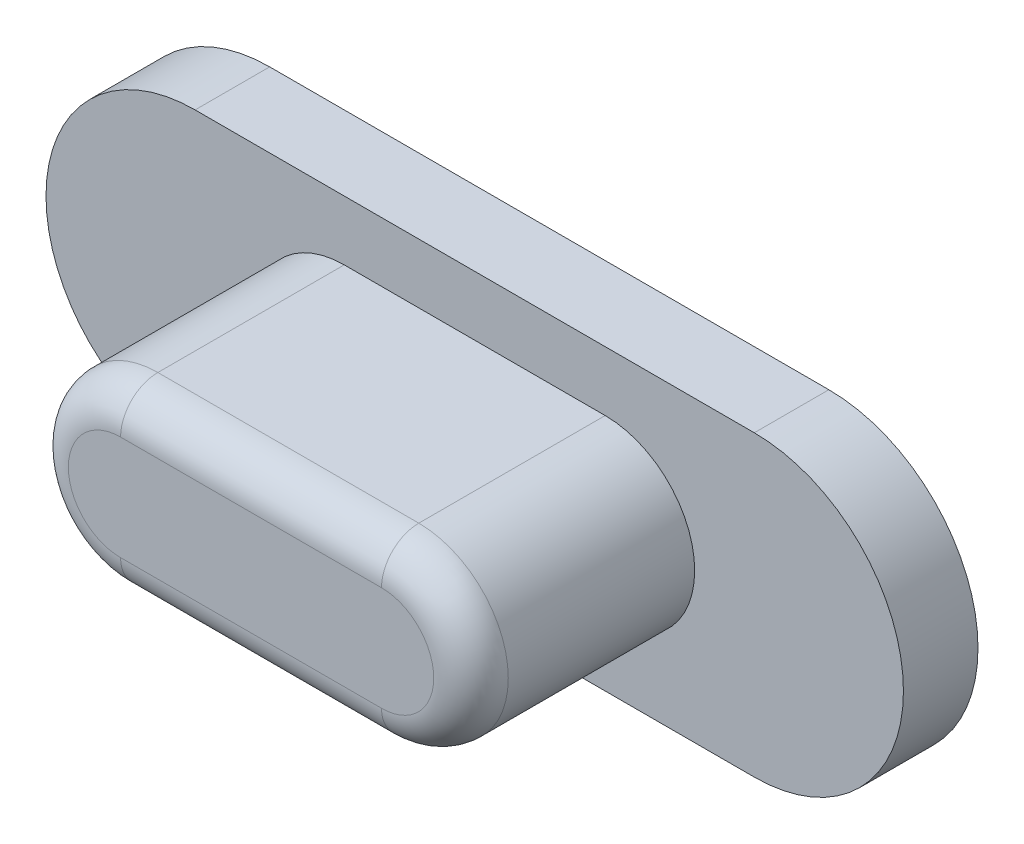
ISO-10303-21;
HEADER;
FILE_DESCRIPTION(('STEP AP214'),'2;1');
FILE_NAME('part.step','',(''),(''),'','','');
FILE_SCHEMA(('AUTOMOTIVE_DESIGN { 1 0 10303 214 1 1 1 1 }'));
ENDSEC;
DATA;
#1=APPLICATION_CONTEXT('core data for automotive mechanical design processes');
#2=APPLICATION_PROTOCOL_DEFINITION('international standard','automotive_design',2000,#1);
#3=PRODUCT_CONTEXT('',#1,'mechanical');
#4=PRODUCT('Part','Part','',(#3));
#5=PRODUCT_RELATED_PRODUCT_CATEGORY('part','',(#4));
#6=PRODUCT_DEFINITION_FORMATION('','',#4);
#7=PRODUCT_DEFINITION_CONTEXT('part definition',#1,'design');
#8=PRODUCT_DEFINITION('design','',#6,#7);
#9=PRODUCT_DEFINITION_SHAPE('','',#8);
#10=(LENGTH_UNIT() NAMED_UNIT(*) SI_UNIT(.MILLI.,.METRE.));
#11=(NAMED_UNIT(*) PLANE_ANGLE_UNIT() SI_UNIT($,.RADIAN.));
#12=(NAMED_UNIT(*) SI_UNIT($,.STERADIAN.) SOLID_ANGLE_UNIT());
#13=UNCERTAINTY_MEASURE_WITH_UNIT(LENGTH_MEASURE(1.E-05),#10,'distance_accuracy_value','');
#14=(GEOMETRIC_REPRESENTATION_CONTEXT(3) GLOBAL_UNCERTAINTY_ASSIGNED_CONTEXT((#13)) GLOBAL_UNIT_ASSIGNED_CONTEXT((#10,
#11,#12)) REPRESENTATION_CONTEXT('',''));
#15=CARTESIAN_POINT('',(0.,0.,0.));
#16=DIRECTION('',(0.,0.,1.));
#17=DIRECTION('',(1.,0.,0.));
#18=AXIS2_PLACEMENT_3D('',#15,#16,#17);
#19=CARTESIAN_POINT('',(4.75,1.25,3.));
#20=DIRECTION('',(0.,0.,-1.));
#21=DIRECTION('',(-1.,0.,0.));
#22=AXIS2_PLACEMENT_3D('',#19,#20,#21);
#23=CYLINDRICAL_SURFACE('',#22,1.2);
#24=DIRECTION('',(0.,0.,-1.));
#25=VECTOR('',#24,1.);
#26=CARTESIAN_POINT('',(4.75,2.45,3.));
#27=LINE('',#26,#25);
#28=CARTESIAN_POINT('',(4.75,2.45,2.5));
#29=VERTEX_POINT('',#28);
#30=CARTESIAN_POINT('',(4.75,2.45,0.));
#31=VERTEX_POINT('',#30);
#32=EDGE_CURVE('E166',#29,#31,#27,.T.);
#33=ORIENTED_EDGE('',*,*,#32,.F.);
#34=CARTESIAN_POINT('',(4.75,1.25,2.5));
#35=DIRECTION('',(0.,0.,1.));
#36=DIRECTION('',(1.,0.,0.));
#37=AXIS2_PLACEMENT_3D('',#34,#35,#36);
#38=CIRCLE('',#37,1.2);
#39=CARTESIAN_POINT('',(4.75,0.0499999999999997,2.5));
#40=VERTEX_POINT('',#39);
#41=EDGE_CURVE('E49',#29,#40,#38,.F.);
#42=ORIENTED_EDGE('',*,*,#41,.T.);
#43=DIRECTION('',(0.,0.,-1.));
#44=VECTOR('',#43,1.);
#45=CARTESIAN_POINT('',(4.75,0.0499999999999997,3.));
#46=LINE('',#45,#44);
#47=CARTESIAN_POINT('',(4.75,0.0499999999999997,0.));
#48=VERTEX_POINT('',#47);
#49=EDGE_CURVE('E160',#40,#48,#46,.T.);
#50=ORIENTED_EDGE('',*,*,#49,.T.);
#51=CARTESIAN_POINT('',(4.75,1.25,0.));
#52=DIRECTION('',(0.,0.,1.));
#53=DIRECTION('',(1.,0.,0.));
#54=AXIS2_PLACEMENT_3D('',#51,#52,#53);
#55=CIRCLE('',#54,1.2);
#56=EDGE_CURVE('E143',#48,#31,#55,.T.);
#57=ORIENTED_EDGE('',*,*,#56,.T.);
#58=EDGE_LOOP('',(#33,#42,#50,#57));
#59=FACE_BOUND('',#58,.T.);
#60=ADVANCED_FACE('F40',(#59),#23,.T.);
#61=CARTESIAN_POINT('',(1.25,2.45,3.));
#62=DIRECTION('',(0.,-1.,0.));
#63=DIRECTION('',(1.,0.,0.));
#64=AXIS2_PLACEMENT_3D('',#61,#62,#63);
#65=PLANE('',#64);
#66=DIRECTION('',(0.,0.,-1.));
#67=VECTOR('',#66,1.);
#68=CARTESIAN_POINT('',(1.25,2.45,3.));
#69=LINE('',#68,#67);
#70=CARTESIAN_POINT('',(1.25,2.45,2.5));
#71=VERTEX_POINT('',#70);
#72=CARTESIAN_POINT('',(1.25,2.45,0.));
#73=VERTEX_POINT('',#72);
#74=EDGE_CURVE('E164',#71,#73,#69,.T.);
#75=ORIENTED_EDGE('',*,*,#74,.F.);
#76=DIRECTION('',(-1.,0.,0.));
#77=VECTOR('',#76,1.);
#78=CARTESIAN_POINT('',(4.75,2.45,2.5));
#79=LINE('',#78,#77);
#80=EDGE_CURVE('E11',#71,#29,#79,.F.);
#81=ORIENTED_EDGE('',*,*,#80,.T.);
#82=ORIENTED_EDGE('',*,*,#32,.T.);
#83=DIRECTION('',(-1.,0.,0.));
#84=VECTOR('',#83,1.);
#85=CARTESIAN_POINT('',(1.25,2.45,0.));
#86=LINE('',#85,#84);
#87=EDGE_CURVE('E146',#31,#73,#86,.T.);
#88=ORIENTED_EDGE('',*,*,#87,.T.);
#89=EDGE_LOOP('',(#75,#81,#82,#88));
#90=FACE_BOUND('',#89,.T.);
#91=ADVANCED_FACE('F224',(#90),#65,.F.);
#92=CARTESIAN_POINT('',(1.25,1.25,3.));
#93=DIRECTION('',(0.,0.,-1.));
#94=DIRECTION('',(-1.,0.,0.));
#95=AXIS2_PLACEMENT_3D('',#92,#93,#94);
#96=CYLINDRICAL_SURFACE('',#95,1.2);
#97=DIRECTION('',(0.,0.,-1.));
#98=VECTOR('',#97,1.);
#99=CARTESIAN_POINT('',(1.25,0.0499999999999995,3.));
#100=LINE('',#99,#98);
#101=CARTESIAN_POINT('',(1.25,0.0499999999999995,2.5));
#102=VERTEX_POINT('',#101);
#103=CARTESIAN_POINT('',(1.25,0.0499999999999995,0.));
#104=VERTEX_POINT('',#103);
#105=EDGE_CURVE('E162',#102,#104,#100,.T.);
#106=ORIENTED_EDGE('',*,*,#105,.F.);
#107=CARTESIAN_POINT('',(1.25,1.25,2.5));
#108=DIRECTION('',(0.,0.,1.));
#109=DIRECTION('',(1.,0.,0.));
#110=AXIS2_PLACEMENT_3D('',#107,#108,#109);
#111=CIRCLE('',#110,1.2);
#112=EDGE_CURVE('E177',#102,#71,#111,.F.);
#113=ORIENTED_EDGE('',*,*,#112,.T.);
#114=ORIENTED_EDGE('',*,*,#74,.T.);
#115=CARTESIAN_POINT('',(1.25,1.25,0.));
#116=DIRECTION('',(0.,0.,1.));
#117=DIRECTION('',(1.,0.,0.));
#118=AXIS2_PLACEMENT_3D('',#115,#116,#117);
#119=CIRCLE('',#118,1.2);
#120=EDGE_CURVE('E154',#73,#104,#119,.T.);
#121=ORIENTED_EDGE('',*,*,#120,.T.);
#122=EDGE_LOOP('',(#106,#113,#114,#121));
#123=FACE_BOUND('',#122,.T.);
#124=ADVANCED_FACE('F229',(#123),#96,.T.);
#125=CARTESIAN_POINT('',(4.75,0.0499999999999997,3.));
#126=DIRECTION('',(0.,1.,0.));
#127=DIRECTION('',(-1.,0.,0.));
#128=AXIS2_PLACEMENT_3D('',#125,#126,#127);
#129=PLANE('',#128);
#130=ORIENTED_EDGE('',*,*,#49,.F.);
#131=DIRECTION('',(1.,0.,0.));
#132=VECTOR('',#131,1.);
#133=CARTESIAN_POINT('',(1.25,0.0499999999999995,2.5));
#134=LINE('',#133,#132);
#135=EDGE_CURVE('E180',#40,#102,#134,.F.);
#136=ORIENTED_EDGE('',*,*,#135,.T.);
#137=ORIENTED_EDGE('',*,*,#105,.T.);
#138=DIRECTION('',(1.,0.,0.));
#139=VECTOR('',#138,1.);
#140=CARTESIAN_POINT('',(4.75,0.0499999999999997,0.));
#141=LINE('',#140,#139);
#142=EDGE_CURVE('E157',#104,#48,#141,.T.);
#143=ORIENTED_EDGE('',*,*,#142,.T.);
#144=EDGE_LOOP('',(#130,#136,#137,#143));
#145=FACE_BOUND('',#144,.T.);
#146=ADVANCED_FACE('F254',(#145),#129,.F.);
#147=CARTESIAN_POINT('',(4.75,1.25,3.));
#148=DIRECTION('',(0.,0.,1.));
#149=DIRECTION('',(1.,0.,0.));
#150=AXIS2_PLACEMENT_3D('',#147,#148,#149);
#151=PLANE('',#150);
#152=DIRECTION('',(-1.,0.,0.));
#153=VECTOR('',#152,1.);
#154=CARTESIAN_POINT('',(1.25,1.95,3.));
#155=LINE('',#154,#153);
#156=CARTESIAN_POINT('',(4.75,1.95,3.));
#157=VERTEX_POINT('',#156);
#158=CARTESIAN_POINT('',(1.25,1.95,3.));
#159=VERTEX_POINT('',#158);
#160=EDGE_CURVE('E168',#157,#159,#155,.T.);
#161=ORIENTED_EDGE('',*,*,#160,.T.);
#162=CARTESIAN_POINT('',(1.25,1.25,3.));
#163=DIRECTION('',(0.,0.,1.));
#164=DIRECTION('',(1.,0.,0.));
#165=AXIS2_PLACEMENT_3D('',#162,#163,#164);
#166=CIRCLE('',#165,0.700000000000001);
#167=CARTESIAN_POINT('',(1.25,0.549999999999999,3.));
#168=VERTEX_POINT('',#167);
#169=EDGE_CURVE('E174',#159,#168,#166,.T.);
#170=ORIENTED_EDGE('',*,*,#169,.T.);
#171=DIRECTION('',(1.,0.,0.));
#172=VECTOR('',#171,1.);
#173=CARTESIAN_POINT('',(4.75,0.55,3.));
#174=LINE('',#173,#172);
#175=CARTESIAN_POINT('',(4.75,0.55,3.));
#176=VERTEX_POINT('',#175);
#177=EDGE_CURVE('E172',#168,#176,#174,.T.);
#178=ORIENTED_EDGE('',*,*,#177,.T.);
#179=CARTESIAN_POINT('',(4.75,1.25,3.));
#180=DIRECTION('',(0.,0.,1.));
#181=DIRECTION('',(1.,0.,0.));
#182=AXIS2_PLACEMENT_3D('',#179,#180,#181);
#183=CIRCLE('',#182,0.7);
#184=EDGE_CURVE('E170',#176,#157,#183,.T.);
#185=ORIENTED_EDGE('',*,*,#184,.T.);
#186=EDGE_LOOP('',(#161,#170,#178,#185));
#187=FACE_BOUND('',#186,.T.);
#188=ADVANCED_FACE('F262',(#187),#151,.T.);
#189=CARTESIAN_POINT('',(0.,3.25,-1.));
#190=DIRECTION('',(0.,-1.,0.));
#191=DIRECTION('',(1.,0.,0.));
#192=AXIS2_PLACEMENT_3D('',#189,#190,#191);
#193=PLANE('',#192);
#194=DIRECTION('',(1.,0.,0.));
#195=VECTOR('',#194,1.);
#196=CARTESIAN_POINT('',(0.,3.25,0.));
#197=LINE('',#196,#195);
#198=CARTESIAN_POINT('',(-0.75,3.25,0.));
#199=VERTEX_POINT('',#198);
#200=CARTESIAN_POINT('',(6.75,3.25,0.));
#201=VERTEX_POINT('',#200);
#202=EDGE_CURVE('E142',#199,#201,#197,.T.);
#203=ORIENTED_EDGE('',*,*,#202,.T.);
#204=DIRECTION('',(0.,0.,1.));
#205=VECTOR('',#204,1.);
#206=CARTESIAN_POINT('',(6.75,3.25,-1.));
#207=LINE('',#206,#205);
#208=CARTESIAN_POINT('',(6.75,3.25,-1.));
#209=VERTEX_POINT('',#208);
#210=EDGE_CURVE('E122',#209,#201,#207,.T.);
#211=ORIENTED_EDGE('',*,*,#210,.F.);
#212=DIRECTION('',(1.,0.,0.));
#213=VECTOR('',#212,1.);
#214=CARTESIAN_POINT('',(0.,3.25,-1.));
#215=LINE('',#214,#213);
#216=CARTESIAN_POINT('',(-0.75,3.25,-1.));
#217=VERTEX_POINT('',#216);
#218=EDGE_CURVE('E129',#217,#209,#215,.T.);
#219=ORIENTED_EDGE('',*,*,#218,.F.);
#220=DIRECTION('',(0.,0.,1.));
#221=VECTOR('',#220,1.);
#222=CARTESIAN_POINT('',(-0.75,3.25,-1.));
#223=LINE('',#222,#221);
#224=EDGE_CURVE('E206',#217,#199,#223,.T.);
#225=ORIENTED_EDGE('',*,*,#224,.T.);
#226=EDGE_LOOP('',(#203,#211,#219,#225));
#227=FACE_BOUND('',#226,.T.);
#228=ADVANCED_FACE('F140',(#227),#193,.F.);
#229=CARTESIAN_POINT('',(6.75,1.25,-1.));
#230=DIRECTION('',(0.,0.,1.));
#231=DIRECTION('',(1.,0.,0.));
#232=AXIS2_PLACEMENT_3D('',#229,#230,#231);
#233=CYLINDRICAL_SURFACE('',#232,2.);
#234=CARTESIAN_POINT('',(6.75,1.25,0.));
#235=DIRECTION('',(0.,0.,-1.));
#236=DIRECTION('',(-1.,0.,0.));
#237=AXIS2_PLACEMENT_3D('',#234,#235,#236);
#238=CIRCLE('',#237,2.);
#239=CARTESIAN_POINT('',(6.75,-0.750000000000001,0.));
#240=VERTEX_POINT('',#239);
#241=EDGE_CURVE('E196',#201,#240,#238,.T.);
#242=ORIENTED_EDGE('',*,*,#241,.T.);
#243=DIRECTION('',(0.,0.,1.));
#244=VECTOR('',#243,1.);
#245=CARTESIAN_POINT('',(6.75,-0.750000000000001,-1.));
#246=LINE('',#245,#244);
#247=CARTESIAN_POINT('',(6.75,-0.750000000000001,-1.));
#248=VERTEX_POINT('',#247);
#249=EDGE_CURVE('E124',#248,#240,#246,.T.);
#250=ORIENTED_EDGE('',*,*,#249,.F.);
#251=CARTESIAN_POINT('',(6.75,1.25,-1.));
#252=DIRECTION('',(0.,0.,-1.));
#253=DIRECTION('',(-1.,0.,0.));
#254=AXIS2_PLACEMENT_3D('',#251,#252,#253);
#255=CIRCLE('',#254,2.);
#256=EDGE_CURVE('E117',#209,#248,#255,.T.);
#257=ORIENTED_EDGE('',*,*,#256,.F.);
#258=ORIENTED_EDGE('',*,*,#210,.T.);
#259=EDGE_LOOP('',(#242,#250,#257,#258));
#260=FACE_BOUND('',#259,.T.);
#261=ADVANCED_FACE('F120',(#260),#233,.T.);
#262=CARTESIAN_POINT('',(0.,-0.75,-1.));
#263=DIRECTION('',(0.,-1.,0.));
#264=DIRECTION('',(1.,0.,0.));
#265=AXIS2_PLACEMENT_3D('',#262,#263,#264);
#266=PLANE('',#265);
#267=DIRECTION('',(1.,0.,0.));
#268=VECTOR('',#267,1.);
#269=CARTESIAN_POINT('',(0.,-0.75,0.));
#270=LINE('',#269,#268);
#271=CARTESIAN_POINT('',(-0.75,-0.75,0.));
#272=VERTEX_POINT('',#271);
#273=EDGE_CURVE('E198',#272,#240,#270,.T.);
#274=ORIENTED_EDGE('',*,*,#273,.F.);
#275=DIRECTION('',(0.,0.,1.));
#276=VECTOR('',#275,1.);
#277=CARTESIAN_POINT('',(-0.75,-0.75,-1.));
#278=LINE('',#277,#276);
#279=CARTESIAN_POINT('',(-0.75,-0.75,-1.));
#280=VERTEX_POINT('',#279);
#281=EDGE_CURVE('E148',#280,#272,#278,.T.);
#282=ORIENTED_EDGE('',*,*,#281,.F.);
#283=DIRECTION('',(1.,0.,0.));
#284=VECTOR('',#283,1.);
#285=CARTESIAN_POINT('',(0.,-0.75,-1.));
#286=LINE('',#285,#284);
#287=EDGE_CURVE('E128',#280,#248,#286,.T.);
#288=ORIENTED_EDGE('',*,*,#287,.T.);
#289=ORIENTED_EDGE('',*,*,#249,.T.);
#290=EDGE_LOOP('',(#274,#282,#288,#289));
#291=FACE_BOUND('',#290,.T.);
#292=ADVANCED_FACE('F214',(#291),#266,.T.);
#293=CARTESIAN_POINT('',(-0.75,1.25,-1.));
#294=DIRECTION('',(0.,0.,1.));
#295=DIRECTION('',(1.,0.,0.));
#296=AXIS2_PLACEMENT_3D('',#293,#294,#295);
#297=CYLINDRICAL_SURFACE('',#296,2.);
#298=CARTESIAN_POINT('',(-0.75,1.25,0.));
#299=DIRECTION('',(0.,0.,-1.));
#300=DIRECTION('',(-1.,0.,0.));
#301=AXIS2_PLACEMENT_3D('',#298,#299,#300);
#302=CIRCLE('',#301,2.);
#303=EDGE_CURVE('E138',#272,#199,#302,.T.);
#304=ORIENTED_EDGE('',*,*,#303,.T.);
#305=ORIENTED_EDGE('',*,*,#224,.F.);
#306=CARTESIAN_POINT('',(-0.75,1.25,-1.));
#307=DIRECTION('',(0.,0.,-1.));
#308=DIRECTION('',(-1.,0.,0.));
#309=AXIS2_PLACEMENT_3D('',#306,#307,#308);
#310=CIRCLE('',#309,2.);
#311=EDGE_CURVE('E134',#280,#217,#310,.T.);
#312=ORIENTED_EDGE('',*,*,#311,.F.);
#313=ORIENTED_EDGE('',*,*,#281,.T.);
#314=EDGE_LOOP('',(#304,#305,#312,#313));
#315=FACE_BOUND('',#314,.T.);
#316=ADVANCED_FACE('F209',(#315),#297,.T.);
#317=CARTESIAN_POINT('',(0.,0.,-1.));
#318=DIRECTION('',(0.,0.,-1.));
#319=DIRECTION('',(-1.,0.,0.));
#320=AXIS2_PLACEMENT_3D('',#317,#318,#319);
#321=PLANE('',#320);
#322=ORIENTED_EDGE('',*,*,#218,.T.);
#323=ORIENTED_EDGE('',*,*,#256,.T.);
#324=ORIENTED_EDGE('',*,*,#287,.F.);
#325=ORIENTED_EDGE('',*,*,#311,.T.);
#326=EDGE_LOOP('',(#322,#323,#324,#325));
#327=FACE_BOUND('',#326,.T.);
#328=ADVANCED_FACE('F132',(#327),#321,.T.);
#329=CARTESIAN_POINT('',(0.,0.,0.));
#330=DIRECTION('',(0.,0.,-1.));
#331=DIRECTION('',(-1.,0.,0.));
#332=AXIS2_PLACEMENT_3D('',#329,#330,#331);
#333=PLANE('',#332);
#334=ORIENTED_EDGE('',*,*,#56,.F.);
#335=ORIENTED_EDGE('',*,*,#142,.F.);
#336=ORIENTED_EDGE('',*,*,#120,.F.);
#337=ORIENTED_EDGE('',*,*,#87,.F.);
#338=EDGE_LOOP('',(#334,#335,#336,#337));
#339=FACE_BOUND('',#338,.T.);
#340=ORIENTED_EDGE('',*,*,#202,.F.);
#341=ORIENTED_EDGE('',*,*,#303,.F.);
#342=ORIENTED_EDGE('',*,*,#273,.T.);
#343=ORIENTED_EDGE('',*,*,#241,.F.);
#344=EDGE_LOOP('',(#340,#341,#342,#343));
#345=FACE_BOUND('',#344,.T.);
#346=ADVANCED_FACE('F213',(#339,#345),#333,.F.);
#347=CARTESIAN_POINT('',(4.75,1.25,2.5));
#348=DIRECTION('',(0.,0.,1.));
#349=DIRECTION('',(1.,0.,0.));
#350=AXIS2_PLACEMENT_3D('',#347,#348,#349);
#351=TOROIDAL_SURFACE('',#350,0.7,0.5);
#352=CARTESIAN_POINT('',(4.75,0.55,2.5));
#353=DIRECTION('',(-1.,0.,0.));
#354=DIRECTION('',(0.,0.,1.));
#355=AXIS2_PLACEMENT_3D('',#352,#353,#354);
#356=CIRCLE('',#355,0.5);
#357=EDGE_CURVE('E186',#40,#176,#356,.T.);
#358=ORIENTED_EDGE('',*,*,#357,.F.);
#359=ORIENTED_EDGE('',*,*,#41,.F.);
#360=CARTESIAN_POINT('',(4.75,1.95,2.5));
#361=DIRECTION('',(-1.,0.,0.));
#362=DIRECTION('',(0.,0.,1.));
#363=AXIS2_PLACEMENT_3D('',#360,#361,#362);
#364=CIRCLE('',#363,0.5);
#365=EDGE_CURVE('E44',#157,#29,#364,.T.);
#366=ORIENTED_EDGE('',*,*,#365,.F.);
#367=ORIENTED_EDGE('',*,*,#184,.F.);
#368=EDGE_LOOP('',(#358,#359,#366,#367));
#369=FACE_BOUND('',#368,.T.);
#370=ADVANCED_FACE('F42',(#369),#351,.T.);
#371=CARTESIAN_POINT('',(4.75,1.95,2.5));
#372=DIRECTION('',(1.,0.,0.));
#373=DIRECTION('',(0.,1.,0.));
#374=AXIS2_PLACEMENT_3D('',#371,#372,#373);
#375=CYLINDRICAL_SURFACE('',#374,0.5);
#376=ORIENTED_EDGE('',*,*,#365,.T.);
#377=ORIENTED_EDGE('',*,*,#80,.F.);
#378=CARTESIAN_POINT('',(1.25,1.95,2.5));
#379=DIRECTION('',(-1.,0.,0.));
#380=DIRECTION('',(0.,0.,1.));
#381=AXIS2_PLACEMENT_3D('',#378,#379,#380);
#382=CIRCLE('',#381,0.5);
#383=EDGE_CURVE('E185',#159,#71,#382,.T.);
#384=ORIENTED_EDGE('',*,*,#383,.F.);
#385=ORIENTED_EDGE('',*,*,#160,.F.);
#386=EDGE_LOOP('',(#376,#377,#384,#385));
#387=FACE_BOUND('',#386,.T.);
#388=ADVANCED_FACE('F239',(#387),#375,.T.);
#389=CARTESIAN_POINT('',(4.75,0.55,2.5));
#390=DIRECTION('',(-1.,0.,0.));
#391=DIRECTION('',(0.,-1.,0.));
#392=AXIS2_PLACEMENT_3D('',#389,#390,#391);
#393=CYLINDRICAL_SURFACE('',#392,0.5);
#394=ORIENTED_EDGE('',*,*,#357,.T.);
#395=ORIENTED_EDGE('',*,*,#177,.F.);
#396=CARTESIAN_POINT('',(1.25,0.549999999999999,2.5));
#397=DIRECTION('',(-1.,0.,0.));
#398=DIRECTION('',(0.,0.,1.));
#399=AXIS2_PLACEMENT_3D('',#396,#397,#398);
#400=CIRCLE('',#399,0.5);
#401=EDGE_CURVE('E183',#102,#168,#400,.T.);
#402=ORIENTED_EDGE('',*,*,#401,.F.);
#403=ORIENTED_EDGE('',*,*,#135,.F.);
#404=EDGE_LOOP('',(#394,#395,#402,#403));
#405=FACE_BOUND('',#404,.T.);
#406=ADVANCED_FACE('F236',(#405),#393,.T.);
#407=CARTESIAN_POINT('',(1.25,1.25,2.5));
#408=DIRECTION('',(0.,0.,1.));
#409=DIRECTION('',(1.,0.,0.));
#410=AXIS2_PLACEMENT_3D('',#407,#408,#409);
#411=TOROIDAL_SURFACE('',#410,0.700000000000001,0.5);
#412=ORIENTED_EDGE('',*,*,#383,.T.);
#413=ORIENTED_EDGE('',*,*,#112,.F.);
#414=ORIENTED_EDGE('',*,*,#401,.T.);
#415=ORIENTED_EDGE('',*,*,#169,.F.);
#416=EDGE_LOOP('',(#412,#413,#414,#415));
#417=FACE_BOUND('',#416,.T.);
#418=ADVANCED_FACE('F233',(#417),#411,.T.);
#419=CLOSED_SHELL('',(#60,#91,#124,#146,#188,#228,#261,#292,#316,#328,#346,#370,#388,#406,#418));
#420=MANIFOLD_SOLID_BREP('B2',#419);
#421=ADVANCED_BREP_SHAPE_REPRESENTATION('',(#18,#420),#14);
#422=SHAPE_DEFINITION_REPRESENTATION(#9,#421);
ENDSEC;
END-ISO-10303-21;
